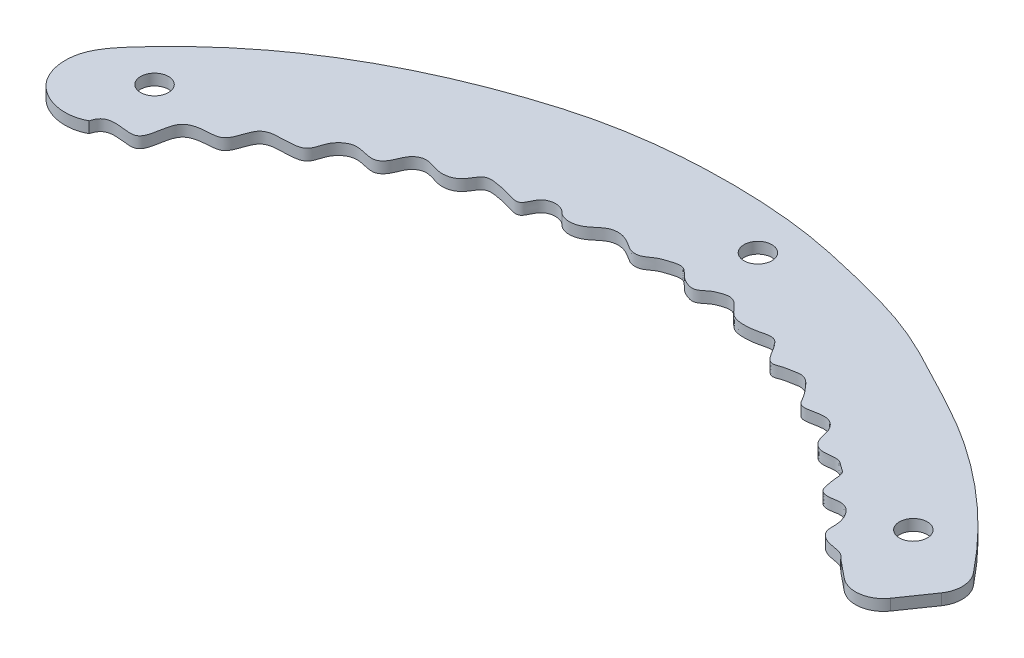
ISO-10303-21;
HEADER;
FILE_DESCRIPTION(('STEP AP214'),'2;1');
FILE_NAME('part.step','',(''),(''),'','','');
FILE_SCHEMA(('AUTOMOTIVE_DESIGN { 1 0 10303 214 1 1 1 1 }'));
ENDSEC;
DATA;
#1=APPLICATION_CONTEXT('core data for automotive mechanical design processes');
#2=APPLICATION_PROTOCOL_DEFINITION('international standard','automotive_design',2000,#1);
#3=PRODUCT_CONTEXT('',#1,'mechanical');
#4=PRODUCT('Part','Part','',(#3));
#5=PRODUCT_RELATED_PRODUCT_CATEGORY('part','',(#4));
#6=PRODUCT_DEFINITION_FORMATION('','',#4);
#7=PRODUCT_DEFINITION_CONTEXT('part definition',#1,'design');
#8=PRODUCT_DEFINITION('design','',#6,#7);
#9=PRODUCT_DEFINITION_SHAPE('','',#8);
#10=(LENGTH_UNIT() NAMED_UNIT(*) SI_UNIT(.MILLI.,.METRE.));
#11=(NAMED_UNIT(*) PLANE_ANGLE_UNIT() SI_UNIT($,.RADIAN.));
#12=(NAMED_UNIT(*) SI_UNIT($,.STERADIAN.) SOLID_ANGLE_UNIT());
#13=UNCERTAINTY_MEASURE_WITH_UNIT(LENGTH_MEASURE(1.E-05),#10,'distance_accuracy_value','');
#14=(GEOMETRIC_REPRESENTATION_CONTEXT(3) GLOBAL_UNCERTAINTY_ASSIGNED_CONTEXT((#13)) GLOBAL_UNIT_ASSIGNED_CONTEXT((#10,
#11,#12)) REPRESENTATION_CONTEXT('',''));
#15=CARTESIAN_POINT('',(0.,0.,0.));
#16=DIRECTION('',(0.,0.,1.));
#17=DIRECTION('',(1.,0.,0.));
#18=AXIS2_PLACEMENT_3D('',#15,#16,#17);
#19=CARTESIAN_POINT('',(3.44900829911821,1.2,6.01107136177327));
#20=DIRECTION('',(0.,1.,0.));
#21=DIRECTION('',(0.,0.,1.));
#22=AXIS2_PLACEMENT_3D('',#19,#20,#21);
#23=PLANE('',#22);
#24=CARTESIAN_POINT('',(0.78303987745354,1.2,0.136157483073447));
#25=DIRECTION('',(0.,1.,0.));
#26=DIRECTION('',(0.,0.,1.));
#27=AXIS2_PLACEMENT_3D('',#24,#25,#26);
#28=CIRCLE('',#27,1.50000000000011);
#29=CARTESIAN_POINT('',(0.78303987745354,1.2,1.63615748307356));
#30=VERTEX_POINT('',#29);
#31=EDGE_CURVE('E248',#30,#30,#28,.T.);
#32=ORIENTED_EDGE('',*,*,#31,.F.);
#33=EDGE_LOOP('',(#32));
#34=FACE_BOUND('',#33,.T.);
#35=CARTESIAN_POINT('',(3.44900829911821,1.2,6.01107136177327));
#36=DIRECTION('',(0.,1.,0.));
#37=DIRECTION('',(0.,0.,1.));
#38=AXIS2_PLACEMENT_3D('',#35,#36,#37);
#39=CIRCLE('',#38,3.00000000000002);
#40=CARTESIAN_POINT('',(1.55484202462136,1.2,8.33747075236784));
#41=VERTEX_POINT('',#40);
#42=CARTESIAN_POINT('',(5.91558487404961,1.2,7.71870129826414));
#43=VERTEX_POINT('',#42);
#44=EDGE_CURVE('E260',#41,#43,#39,.T.);
#45=ORIENTED_EDGE('',*,*,#44,.T.);
#46=DIRECTION('',(0.569209978830285,0.,-0.822192191643794));
#47=VECTOR('',#46,1.);
#48=CARTESIAN_POINT('',(8.14322778461929,1.2,4.50099487188552));
#49=LINE('',#48,#47);
#50=CARTESIAN_POINT('',(8.1432277846193,1.2,4.50099487188553));
#51=VERTEX_POINT('',#50);
#52=EDGE_CURVE('E105',#43,#51,#49,.T.);
#53=ORIENTED_EDGE('',*,*,#52,.T.);
#54=CARTESIAN_POINT('',(5.67665120968791,1.2,2.79336493539468));
#55=DIRECTION('',(0.,1.,0.));
#56=DIRECTION('',(0.,0.,1.));
#57=AXIS2_PLACEMENT_3D('',#54,#55,#56);
#58=CIRCLE('',#57,2.99999999999999);
#59=CARTESIAN_POINT('',(8.02129778197895,1.2,0.921832822113208));
#60=VERTEX_POINT('',#59);
#61=EDGE_CURVE('E262',#51,#60,#58,.T.);
#62=ORIENTED_EDGE('',*,*,#61,.T.);
#63=CARTESIAN_POINT('',(-35.7027580415051,1.2,35.8230309658508));
#64=DIRECTION('',(0.,1.,0.));
#65=DIRECTION('',(0.,0.,1.));
#66=AXIS2_PLACEMENT_3D('',#63,#64,#65);
#67=CIRCLE('',#66,55.9453902437331);
#68=CARTESIAN_POINT('',(-4.57488763843811,1.2,-10.6629064098056));
#69=VERTEX_POINT('',#68);
#70=EDGE_CURVE('E191',#60,#69,#67,.T.);
#71=ORIENTED_EDGE('',*,*,#70,.T.);
#72=CARTESIAN_POINT('',(-4.57488763843811,1.2,-10.6629064098056));
#73=CARTESIAN_POINT('',(-7.04777633310377,1.2,-12.3187998510135));
#74=CARTESIAN_POINT('',(-11.4723769219833,1.2,-14.6181640587533));
#75=CARTESIAN_POINT('',(-18.6446226281622,1.2,-18.4462764903407));
#76=CARTESIAN_POINT('',(-25.5528261175574,1.2,-20.2853460344889));
#77=CARTESIAN_POINT('',(-32.3111472553235,1.2,-21.765124491277));
#78=CARTESIAN_POINT('',(-38.4562227604874,1.2,-22.3344853318809));
#79=CARTESIAN_POINT('',(-46.0367308056514,1.2,-22.3379740281444));
#80=CARTESIAN_POINT('',(-53.5805608519174,1.2,-21.3214272767711));
#81=CARTESIAN_POINT('',(-60.391912278173,1.2,-19.2595532220798));
#82=CARTESIAN_POINT('',(-67.9164928459804,1.2,-16.4005668721405));
#83=CARTESIAN_POINT('',(-77.0440915873863,1.2,-11.4902201250957));
#84=CARTESIAN_POINT('',(-84.229889168822,1.2,-5.09611514235832));
#85=CARTESIAN_POINT('',(-88.4718293066358,1.2,-0.104808879087911));
#86=CARTESIAN_POINT('',(-88.5463339267075,1.2,3.09934105526218));
#87=CARTESIAN_POINT('',(-86.8959532553335,1.2,6.53469906582001));
#88=CARTESIAN_POINT('',(-83.4963465539946,1.2,7.40947439728391));
#89=CARTESIAN_POINT('',(-81.5421780768788,1.2,6.35126814352929));
#90=B_SPLINE_CURVE_WITH_KNOTS('',3,(#72,#73,#74,#75,#76,#77,#78,#79,#80,#81,#82,#83,#84,#85,#86,
#87,#88,#89),.UNSPECIFIED.,.F.,.F.,(4,1,1,1,1,1,1,1,1,1,1,1,1,1,1,4),(0.083499365060497,
0.162308773326712,0.214040794515801,0.297345887842816,0.3491544880349,0.396314502565913,
0.45953043380621,0.548645128958728,0.595484356958903,0.646703324821764,0.760819589852608,
0.864658635925295,0.902713076006373,0.926128155665857,0.944546811556018,1.),.UNSPECIFIED.);
#91=CARTESIAN_POINT('',(-81.5421780768788,1.2,6.35126814352929));
#92=VERTEX_POINT('',#91);
#93=EDGE_CURVE('E183',#69,#92,#90,.T.);
#94=ORIENTED_EDGE('',*,*,#93,.T.);
#95=CARTESIAN_POINT('',(-81.5421780768788,1.2,6.35126814352929));
#96=CARTESIAN_POINT('',(-81.0448448428818,1.2,4.21362532073832));
#97=CARTESIAN_POINT('',(-76.4233455205633,1.2,7.04419919794764));
#98=CARTESIAN_POINT('',(-77.1938888372418,1.2,1.43461180448703));
#99=CARTESIAN_POINT('',(-74.4995580507389,1.2,1.00713796243328));
#100=CARTESIAN_POINT('',(-72.1195795464039,1.2,0.982023335802329));
#101=CARTESIAN_POINT('',(-72.0139132139392,1.2,-2.53193035754506));
#102=CARTESIAN_POINT('',(-69.1934461070888,1.2,-2.2707681802793));
#103=CARTESIAN_POINT('',(-66.9790185832169,1.2,-2.57683442806185));
#104=CARTESIAN_POINT('',(-66.7933372654512,1.2,-4.56149158223045));
#105=CARTESIAN_POINT('',(-65.2281719656522,1.2,-5.86647802015679));
#106=CARTESIAN_POINT('',(-63.704347584588,1.2,-5.43120710896552));
#107=CARTESIAN_POINT('',(-62.4806614615817,1.2,-5.2333978483326));
#108=CARTESIAN_POINT('',(-61.4837151569637,1.2,-6.19912528435516));
#109=CARTESIAN_POINT('',(-61.3005528493581,1.2,-7.50315956175206));
#110=CARTESIAN_POINT('',(-59.783145719068,1.2,-8.3975867452717));
#111=CARTESIAN_POINT('',(-58.5197580633333,1.2,-7.70306229476587));
#112=CARTESIAN_POINT('',(-57.0959702031179,1.2,-7.65884087926026));
#113=CARTESIAN_POINT('',(-55.8360258529427,1.2,-8.29464929645206));
#114=CARTESIAN_POINT('',(-55.3246003603198,1.2,-9.90126935389747));
#115=CARTESIAN_POINT('',(-53.5853261707726,1.2,-9.70208532278235));
#116=CARTESIAN_POINT('',(-52.4002094473756,1.2,-9.42294579581385));
#117=CARTESIAN_POINT('',(-50.5843936123462,1.2,-8.81311630128934));
#118=CARTESIAN_POINT('',(-50.1680473428663,1.2,-11.1138726333681));
#119=CARTESIAN_POINT('',(-48.3351648245672,1.2,-11.1661381134778));
#120=CARTESIAN_POINT('',(-47.7150050803411,1.2,-10.6051101678702));
#121=B_SPLINE_CURVE_WITH_KNOTS('',3,(#95,#96,#97,#98,#99,#100,#101,#102,#103,#104,#105,#106,
#107,#108,#109,#110,#111,#112,#113,#114,#115,#116,#117,#118,#119,#120),.UNSPECIFIED.,.F.,.F.,(4,
1,1,1,1,1,1,1,1,1,1,1,1,1,1,1,1,1,1,1,1,1,1,4),(0.,0.10033187251802,0.186040251980362,
0.234954160897993,0.27030048666237,0.337741821565506,0.401919809800173,0.438279807635281,
0.476829940838354,0.523229195146984,0.559516768423253,0.584172910344551,0.604077360684183,
0.648703102907347,0.670042470876268,0.715950186250387,0.738312733574355,0.768610762270448,
0.808997732952222,0.834826143984133,0.875875240279468,0.90640030465833,0.941714400143514,1.),.UNSPECIFIED.);
#122=CARTESIAN_POINT('',(-47.7150050803411,1.2,-10.6051101678702));
#123=VERTEX_POINT('',#122);
#124=EDGE_CURVE('E175',#92,#123,#121,.T.);
#125=ORIENTED_EDGE('',*,*,#124,.T.);
#126=CARTESIAN_POINT('',(-47.7150050803411,1.2,-10.6051101678702));
#127=CARTESIAN_POINT('',(-47.0690124810321,1.2,-9.90066506813963));
#128=CARTESIAN_POINT('',(-45.1391969493978,1.2,-9.95795741044139));
#129=CARTESIAN_POINT('',(-43.9219754910409,1.2,-11.5863741457182));
#130=CARTESIAN_POINT('',(-42.4007210025674,1.2,-11.7710165682273));
#131=CARTESIAN_POINT('',(-41.3374820071162,1.2,-11.3076810836852));
#132=CARTESIAN_POINT('',(-40.4080819702577,1.2,-10.5713924926002));
#133=CARTESIAN_POINT('',(-39.2432630977495,1.2,-10.6059481905331));
#134=CARTESIAN_POINT('',(-38.4214004000452,1.2,-11.3898176735715));
#135=CARTESIAN_POINT('',(-37.3041253919222,1.2,-11.739033216268));
#136=CARTESIAN_POINT('',(-35.9600154286698,1.2,-12.1776783260087));
#137=CARTESIAN_POINT('',(-35.1697302390645,1.2,-11.0958898837788));
#138=CARTESIAN_POINT('',(-34.3091162567702,1.2,-10.5975749451474));
#139=CARTESIAN_POINT('',(-33.2301982844589,1.2,-10.3267588025516));
#140=CARTESIAN_POINT('',(-32.483614479217,1.2,-11.1724986113062));
#141=CARTESIAN_POINT('',(-31.5559314423124,1.2,-11.5569313141941));
#142=CARTESIAN_POINT('',(-30.496219104149,1.2,-11.8331708357779));
#143=CARTESIAN_POINT('',(-29.5445792105868,1.2,-11.0114210420582));
#144=CARTESIAN_POINT('',(-28.7648620105408,1.2,-9.93104888314241));
#145=CARTESIAN_POINT('',(-27.2750400536467,1.2,-9.79158769570499));
#146=CARTESIAN_POINT('',(-25.6778686598355,1.2,-9.9955076733502));
#147=CARTESIAN_POINT('',(-24.4296320894705,1.2,-10.4937438684952));
#148=CARTESIAN_POINT('',(-23.910622578037,1.2,-9.60570397833224));
#149=B_SPLINE_CURVE_WITH_KNOTS('',3,(#126,#127,#128,#129,#130,#131,#132,#133,#134,#135,#136,
#137,#138,#139,#140,#141,#142,#143,#144,#145,#146,#147,#148),.UNSPECIFIED.,.F.,.F.,(4,1,1,1,1,1,
1,1,1,1,1,1,1,1,1,1,1,1,1,1,4),(0.,0.101433112648439,0.182304189498544,0.213922122931523,
0.268056795835965,0.309965908906496,0.345937919861134,0.389140378033071,0.432998877346524,
0.482664358285046,0.529097115106778,0.566719549823674,0.598853251916691,0.64417277734227,
0.680167064302808,0.715860802220602,0.759457234327231,0.810995739914042,0.863337515382828,
0.916048189125692,1.),.UNSPECIFIED.);
#150=CARTESIAN_POINT('',(-23.910622578037,1.2,-9.60570397833224));
#151=VERTEX_POINT('',#150);
#152=EDGE_CURVE('E130',#123,#151,#149,.T.);
#153=ORIENTED_EDGE('',*,*,#152,.T.);
#154=CARTESIAN_POINT('',(-23.910622578037,1.2,-9.60570397833224));
#155=CARTESIAN_POINT('',(-23.5582513135529,1.2,-9.38304177558806));
#156=CARTESIAN_POINT('',(-22.8500102499487,1.2,-7.30011493564436));
#157=CARTESIAN_POINT('',(-21.4690994371349,1.2,-8.02662073216218));
#158=CARTESIAN_POINT('',(-20.5875764592206,1.2,-8.11523773214938));
#159=CARTESIAN_POINT('',(-19.7095483707754,1.2,-8.39310202218204));
#160=CARTESIAN_POINT('',(-18.8873736075052,1.2,-8.01697173333));
#161=CARTESIAN_POINT('',(-18.2163702789371,1.2,-7.27057210352965));
#162=CARTESIAN_POINT('',(-17.5409166683346,1.2,-6.49538420712898));
#163=CARTESIAN_POINT('',(-16.9173311110878,1.2,-5.16981924116291));
#164=CARTESIAN_POINT('',(-15.3663101547252,1.2,-5.58870520220975));
#165=CARTESIAN_POINT('',(-13.9067451345584,1.2,-5.74785230448149));
#166=CARTESIAN_POINT('',(-12.700950999441,1.2,-4.35010199287027));
#167=CARTESIAN_POINT('',(-12.8698073188407,1.2,-3.10943631230547));
#168=CARTESIAN_POINT('',(-12.1670130888093,1.2,-2.58249548575534));
#169=B_SPLINE_CURVE_WITH_KNOTS('',3,(#154,#155,#156,#157,#158,#159,#160,#161,#162,#163,#164,
#165,#166,#167,#168),.UNSPECIFIED.,.F.,.F.,(4,1,1,1,1,1,1,1,1,1,1,1,4),(0.,0.161236224841132,
0.21234834378781,0.265446348457359,0.336192935648755,0.378687986034091,0.4306367840808,
0.526782427636082,0.583170289821279,0.682556586618731,0.781270877614231,0.853713789343026,1.),.UNSPECIFIED.);
#170=CARTESIAN_POINT('',(-12.1670130888093,1.2,-2.58249548575534));
#171=VERTEX_POINT('',#170);
#172=EDGE_CURVE('E124',#151,#171,#169,.T.);
#173=ORIENTED_EDGE('',*,*,#172,.T.);
#174=CARTESIAN_POINT('',(-12.1670130888093,1.2,-2.58249548575534));
#175=CARTESIAN_POINT('',(-11.4471191644706,1.2,-1.92134095269998));
#176=CARTESIAN_POINT('',(-10.0229848414878,1.2,-2.80818773415737));
#177=CARTESIAN_POINT('',(-8.9763546571775,1.2,-1.80910880069845));
#178=CARTESIAN_POINT('',(-8.21349909352739,1.2,-1.4039744706188));
#179=CARTESIAN_POINT('',(-8.2003912361652,1.2,-0.349911537247775));
#180=CARTESIAN_POINT('',(-8.04255591781491,1.2,0.49397857915872));
#181=CARTESIAN_POINT('',(-7.81895994369961,1.2,1.42941329555678));
#182=CARTESIAN_POINT('',(-6.81689072199512,1.2,1.75353348258345));
#183=CARTESIAN_POINT('',(-5.86360128751454,1.2,1.34252738010585));
#184=CARTESIAN_POINT('',(-4.74128182851249,1.2,1.71096285828227));
#185=CARTESIAN_POINT('',(-4.08275958970314,1.2,2.62138877906185));
#186=CARTESIAN_POINT('',(-3.79245167016543,1.2,3.75124872269137));
#187=CARTESIAN_POINT('',(-3.91045160965189,1.2,4.86930890456373));
#188=CARTESIAN_POINT('',(-3.23211233625173,1.2,5.62677614963317));
#189=CARTESIAN_POINT('',(-2.20666131595101,1.2,6.03043208241771));
#190=CARTESIAN_POINT('',(-1.04611431687965,1.2,6.06255734799648));
#191=CARTESIAN_POINT('',(-0.554897819244199,1.2,6.5645372027341));
#192=CARTESIAN_POINT('',(-0.430182488183412,1.2,6.72125364820013));
#193=B_SPLINE_CURVE_WITH_KNOTS('',3,(#174,#175,#176,#177,#178,#179,#180,#181,#182,#183,#184,
#185,#186,#187,#188,#189,#190,#191,#192),.UNSPECIFIED.,.F.,.F.,(4,1,1,1,1,1,1,1,1,1,1,1,1,1,1,1,
4),(0.,0.0360977535232211,0.0479926916056579,0.0581817737763515,0.0697347680121679,
0.0877085924399377,0.0966984007408338,0.107023851289053,0.126400839421723,0.138602891285937,
0.153227265236612,0.171393147328841,0.187122158128167,0.197485969105478,0.21117177381614,
0.233173167270583,0.241577569364449),.UNSPECIFIED.);
#194=CARTESIAN_POINT('',(-0.430182488183384,1.2,6.72125364820013));
#195=VERTEX_POINT('',#194);
#196=EDGE_CURVE('E128',#171,#195,#193,.T.);
#197=ORIENTED_EDGE('',*,*,#196,.T.);
#198=DIRECTION('',(0.77546646353152,0.,0.631388758165615));
#199=VECTOR('',#198,1.);
#200=CARTESIAN_POINT('',(1.55484202462136,1.2,8.33747075236784));
#201=LINE('',#200,#199);
#202=EDGE_CURVE('E56',#195,#41,#201,.T.);
#203=ORIENTED_EDGE('',*,*,#202,.T.);
#204=EDGE_LOOP('',(#45,#53,#62,#71,#94,#125,#153,#173,#197,#203));
#205=FACE_BOUND('',#204,.T.);
#206=CARTESIAN_POINT('',(-81.4136972901319,1.2,-0.541251493306819));
#207=DIRECTION('',(0.,1.,0.));
#208=DIRECTION('',(0.,0.,1.));
#209=AXIS2_PLACEMENT_3D('',#206,#207,#208);
#210=CIRCLE('',#209,1.5);
#211=CARTESIAN_POINT('',(-81.4136972901319,1.2,0.958748506693179));
#212=VERTEX_POINT('',#211);
#213=EDGE_CURVE('E254',#212,#212,#210,.T.);
#214=ORIENTED_EDGE('',*,*,#213,.F.);
#215=EDGE_LOOP('',(#214));
#216=FACE_BOUND('',#215,.T.);
#217=CARTESIAN_POINT('',(-33.3547852261345,1.2,-17.3022086811354));
#218=DIRECTION('',(0.,1.,0.));
#219=DIRECTION('',(0.,0.,1.));
#220=AXIS2_PLACEMENT_3D('',#217,#218,#219);
#221=CIRCLE('',#220,1.50000000000011);
#222=CARTESIAN_POINT('',(-33.3547852261345,1.2,-15.8022086811352));
#223=VERTEX_POINT('',#222);
#224=EDGE_CURVE('E239',#223,#223,#221,.T.);
#225=ORIENTED_EDGE('',*,*,#224,.F.);
#226=EDGE_LOOP('',(#225));
#227=FACE_BOUND('',#226,.T.);
#228=ADVANCED_FACE('F39',(#34,#205,#216,#227),#23,.T.);
#229=CARTESIAN_POINT('',(3.44900829911821,0.,6.01107136177327));
#230=DIRECTION('',(0.,1.,0.));
#231=DIRECTION('',(0.,0.,1.));
#232=AXIS2_PLACEMENT_3D('',#229,#230,#231);
#233=PLANE('',#232);
#234=CARTESIAN_POINT('',(0.78303987745354,0.,0.136157483073447));
#235=DIRECTION('',(0.,1.,0.));
#236=DIRECTION('',(0.,0.,1.));
#237=AXIS2_PLACEMENT_3D('',#234,#235,#236);
#238=CIRCLE('',#237,1.50000000000011);
#239=CARTESIAN_POINT('',(0.78303987745354,0.,1.63615748307356));
#240=VERTEX_POINT('',#239);
#241=EDGE_CURVE('E245',#240,#240,#238,.T.);
#242=ORIENTED_EDGE('',*,*,#241,.T.);
#243=EDGE_LOOP('',(#242));
#244=FACE_BOUND('',#243,.T.);
#245=CARTESIAN_POINT('',(3.44900829911821,0.,6.01107136177327));
#246=DIRECTION('',(0.,1.,0.));
#247=DIRECTION('',(0.,0.,1.));
#248=AXIS2_PLACEMENT_3D('',#245,#246,#247);
#249=CIRCLE('',#248,3.00000000000002);
#250=CARTESIAN_POINT('',(1.55484202462136,0.,8.33747075236784));
#251=VERTEX_POINT('',#250);
#252=CARTESIAN_POINT('',(5.91558487404961,0.,7.71870129826414));
#253=VERTEX_POINT('',#252);
#254=EDGE_CURVE('E257',#251,#253,#249,.T.);
#255=ORIENTED_EDGE('',*,*,#254,.F.);
#256=DIRECTION('',(0.77546646353152,0.,0.631388758165615));
#257=VECTOR('',#256,1.);
#258=CARTESIAN_POINT('',(1.55484202462136,0.,8.33747075236784));
#259=LINE('',#258,#257);
#260=CARTESIAN_POINT('',(-0.430182488183384,0.,6.72125364820013));
#261=VERTEX_POINT('',#260);
#262=EDGE_CURVE('E97',#261,#251,#259,.T.);
#263=ORIENTED_EDGE('',*,*,#262,.F.);
#264=CARTESIAN_POINT('',(-12.1670130888093,0.,-2.58249548575534));
#265=CARTESIAN_POINT('',(-11.4471191644706,0.,-1.92134095269998));
#266=CARTESIAN_POINT('',(-10.0229848414878,0.,-2.80818773415737));
#267=CARTESIAN_POINT('',(-8.9763546571775,0.,-1.80910880069845));
#268=CARTESIAN_POINT('',(-8.21349909352739,0.,-1.4039744706188));
#269=CARTESIAN_POINT('',(-8.2003912361652,0.,-0.349911537247775));
#270=CARTESIAN_POINT('',(-8.04255591781491,0.,0.49397857915872));
#271=CARTESIAN_POINT('',(-7.81895994369961,0.,1.42941329555678));
#272=CARTESIAN_POINT('',(-6.81689072199512,0.,1.75353348258345));
#273=CARTESIAN_POINT('',(-5.86360128751454,0.,1.34252738010585));
#274=CARTESIAN_POINT('',(-4.74128182851249,0.,1.71096285828227));
#275=CARTESIAN_POINT('',(-4.08275958970314,0.,2.62138877906185));
#276=CARTESIAN_POINT('',(-3.79245167016543,0.,3.75124872269137));
#277=CARTESIAN_POINT('',(-3.91045160965189,0.,4.86930890456373));
#278=CARTESIAN_POINT('',(-3.23211233625173,0.,5.62677614963317));
#279=CARTESIAN_POINT('',(-2.20666131595101,0.,6.03043208241771));
#280=CARTESIAN_POINT('',(-1.04611431687965,0.,6.06255734799648));
#281=CARTESIAN_POINT('',(-0.554897819244199,0.,6.5645372027341));
#282=CARTESIAN_POINT('',(-0.430182488183412,0.,6.72125364820013));
#283=B_SPLINE_CURVE_WITH_KNOTS('',3,(#264,#265,#266,#267,#268,#269,#270,#271,#272,#273,#274,
#275,#276,#277,#278,#279,#280,#281,#282),.UNSPECIFIED.,.F.,.F.,(4,1,1,1,1,1,1,1,1,1,1,1,1,1,1,1,
4),(0.,0.0360977535232211,0.0479926916056579,0.0581817737763515,0.0697347680121679,
0.0877085924399377,0.0966984007408338,0.107023851289053,0.126400839421723,0.138602891285937,
0.153227265236612,0.171393147328841,0.187122158128167,0.197485969105478,0.21117177381614,
0.233173167270583,0.241577569364449),.UNSPECIFIED.);
#284=CARTESIAN_POINT('',(-12.1670130888093,0.,-2.58249548575534));
#285=VERTEX_POINT('',#284);
#286=EDGE_CURVE('E91',#285,#261,#283,.T.);
#287=ORIENTED_EDGE('',*,*,#286,.F.);
#288=CARTESIAN_POINT('',(-23.910622578037,0.,-9.60570397833224));
#289=CARTESIAN_POINT('',(-23.5582513135529,0.,-9.38304177558806));
#290=CARTESIAN_POINT('',(-22.8500102499487,0.,-7.30011493564436));
#291=CARTESIAN_POINT('',(-21.4690994371349,0.,-8.02662073216218));
#292=CARTESIAN_POINT('',(-20.5875764592206,0.,-8.11523773214938));
#293=CARTESIAN_POINT('',(-19.7095483707754,0.,-8.39310202218204));
#294=CARTESIAN_POINT('',(-18.8873736075052,0.,-8.01697173333));
#295=CARTESIAN_POINT('',(-18.2163702789371,0.,-7.27057210352965));
#296=CARTESIAN_POINT('',(-17.5409166683346,0.,-6.49538420712898));
#297=CARTESIAN_POINT('',(-16.9173311110878,0.,-5.16981924116291));
#298=CARTESIAN_POINT('',(-15.3663101547252,0.,-5.58870520220975));
#299=CARTESIAN_POINT('',(-13.9067451345584,0.,-5.74785230448149));
#300=CARTESIAN_POINT('',(-12.700950999441,0.,-4.35010199287027));
#301=CARTESIAN_POINT('',(-12.8698073188407,0.,-3.10943631230547));
#302=CARTESIAN_POINT('',(-12.1670130888093,0.,-2.58249548575534));
#303=B_SPLINE_CURVE_WITH_KNOTS('',3,(#288,#289,#290,#291,#292,#293,#294,#295,#296,#297,#298,
#299,#300,#301,#302),.UNSPECIFIED.,.F.,.F.,(4,1,1,1,1,1,1,1,1,1,1,1,4),(0.,0.161236224841132,
0.21234834378781,0.265446348457359,0.336192935648755,0.378687986034091,0.4306367840808,
0.526782427636082,0.583170289821279,0.682556586618731,0.781270877614231,0.853713789343026,1.),.UNSPECIFIED.);
#304=CARTESIAN_POINT('',(-23.910622578037,0.,-9.60570397833224));
#305=VERTEX_POINT('',#304);
#306=EDGE_CURVE('E138',#305,#285,#303,.T.);
#307=ORIENTED_EDGE('',*,*,#306,.F.);
#308=CARTESIAN_POINT('',(-47.7150050803411,0.,-10.6051101678702));
#309=CARTESIAN_POINT('',(-47.0690124810321,0.,-9.90066506813963));
#310=CARTESIAN_POINT('',(-45.1391969493978,0.,-9.95795741044139));
#311=CARTESIAN_POINT('',(-43.9219754910409,0.,-11.5863741457182));
#312=CARTESIAN_POINT('',(-42.4007210025674,0.,-11.7710165682273));
#313=CARTESIAN_POINT('',(-41.3374820071162,0.,-11.3076810836852));
#314=CARTESIAN_POINT('',(-40.4080819702577,0.,-10.5713924926002));
#315=CARTESIAN_POINT('',(-39.2432630977495,0.,-10.6059481905331));
#316=CARTESIAN_POINT('',(-38.4214004000452,0.,-11.3898176735715));
#317=CARTESIAN_POINT('',(-37.3041253919222,0.,-11.739033216268));
#318=CARTESIAN_POINT('',(-35.9600154286698,0.,-12.1776783260087));
#319=CARTESIAN_POINT('',(-35.1697302390645,0.,-11.0958898837788));
#320=CARTESIAN_POINT('',(-34.3091162567702,0.,-10.5975749451474));
#321=CARTESIAN_POINT('',(-33.2301982844589,0.,-10.3267588025516));
#322=CARTESIAN_POINT('',(-32.483614479217,0.,-11.1724986113062));
#323=CARTESIAN_POINT('',(-31.5559314423124,0.,-11.5569313141941));
#324=CARTESIAN_POINT('',(-30.496219104149,0.,-11.8331708357779));
#325=CARTESIAN_POINT('',(-29.5445792105868,0.,-11.0114210420582));
#326=CARTESIAN_POINT('',(-28.7648620105408,0.,-9.93104888314241));
#327=CARTESIAN_POINT('',(-27.2750400536467,0.,-9.79158769570499));
#328=CARTESIAN_POINT('',(-25.6778686598355,0.,-9.9955076733502));
#329=CARTESIAN_POINT('',(-24.4296320894705,0.,-10.4937438684952));
#330=CARTESIAN_POINT('',(-23.910622578037,0.,-9.60570397833224));
#331=B_SPLINE_CURVE_WITH_KNOTS('',3,(#308,#309,#310,#311,#312,#313,#314,#315,#316,#317,#318,
#319,#320,#321,#322,#323,#324,#325,#326,#327,#328,#329,#330),.UNSPECIFIED.,.F.,.F.,(4,1,1,1,1,1,
1,1,1,1,1,1,1,1,1,1,1,1,1,1,4),(0.,0.101433112648439,0.182304189498544,0.213922122931523,
0.268056795835965,0.309965908906496,0.345937919861134,0.389140378033071,0.432998877346524,
0.482664358285046,0.529097115106778,0.566719549823674,0.598853251916691,0.64417277734227,
0.680167064302808,0.715860802220602,0.759457234327231,0.810995739914042,0.863337515382828,
0.916048189125692,1.),.UNSPECIFIED.);
#332=CARTESIAN_POINT('',(-47.7150050803411,0.,-10.6051101678702));
#333=VERTEX_POINT('',#332);
#334=EDGE_CURVE('E290',#333,#305,#331,.T.);
#335=ORIENTED_EDGE('',*,*,#334,.F.);
#336=CARTESIAN_POINT('',(-81.5421780768788,0.,6.35126814352929));
#337=CARTESIAN_POINT('',(-81.0448448428818,0.,4.21362532073832));
#338=CARTESIAN_POINT('',(-76.4233455205633,0.,7.04419919794764));
#339=CARTESIAN_POINT('',(-77.1938888372418,0.,1.43461180448703));
#340=CARTESIAN_POINT('',(-74.4995580507389,0.,1.00713796243328));
#341=CARTESIAN_POINT('',(-72.1195795464039,0.,0.982023335802329));
#342=CARTESIAN_POINT('',(-72.0139132139392,0.,-2.53193035754506));
#343=CARTESIAN_POINT('',(-69.1934461070888,0.,-2.2707681802793));
#344=CARTESIAN_POINT('',(-66.9790185832169,0.,-2.57683442806185));
#345=CARTESIAN_POINT('',(-66.7933372654512,0.,-4.56149158223045));
#346=CARTESIAN_POINT('',(-65.2281719656522,0.,-5.86647802015679));
#347=CARTESIAN_POINT('',(-63.704347584588,0.,-5.43120710896552));
#348=CARTESIAN_POINT('',(-62.4806614615817,0.,-5.2333978483326));
#349=CARTESIAN_POINT('',(-61.4837151569637,0.,-6.19912528435516));
#350=CARTESIAN_POINT('',(-61.3005528493581,0.,-7.50315956175206));
#351=CARTESIAN_POINT('',(-59.783145719068,0.,-8.3975867452717));
#352=CARTESIAN_POINT('',(-58.5197580633333,0.,-7.70306229476587));
#353=CARTESIAN_POINT('',(-57.0959702031179,0.,-7.65884087926026));
#354=CARTESIAN_POINT('',(-55.8360258529427,0.,-8.29464929645206));
#355=CARTESIAN_POINT('',(-55.3246003603198,0.,-9.90126935389747));
#356=CARTESIAN_POINT('',(-53.5853261707726,0.,-9.70208532278235));
#357=CARTESIAN_POINT('',(-52.4002094473756,0.,-9.42294579581385));
#358=CARTESIAN_POINT('',(-50.5843936123462,0.,-8.81311630128934));
#359=CARTESIAN_POINT('',(-50.1680473428663,0.,-11.1138726333681));
#360=CARTESIAN_POINT('',(-48.3351648245672,0.,-11.1661381134778));
#361=CARTESIAN_POINT('',(-47.7150050803411,0.,-10.6051101678702));
#362=B_SPLINE_CURVE_WITH_KNOTS('',3,(#336,#337,#338,#339,#340,#341,#342,#343,#344,#345,#346,
#347,#348,#349,#350,#351,#352,#353,#354,#355,#356,#357,#358,#359,#360,#361),.UNSPECIFIED.,.F.,
.F.,(4,1,1,1,1,1,1,1,1,1,1,1,1,1,1,1,1,1,1,1,1,1,1,4),(0.,0.10033187251802,0.186040251980362,
0.234954160897993,0.27030048666237,0.337741821565506,0.401919809800173,0.438279807635281,
0.476829940838354,0.523229195146984,0.559516768423253,0.584172910344551,0.604077360684183,
0.648703102907347,0.670042470876268,0.715950186250387,0.738312733574355,0.768610762270448,
0.808997732952222,0.834826143984133,0.875875240279468,0.90640030465833,0.941714400143514,1.),.UNSPECIFIED.);
#363=CARTESIAN_POINT('',(-81.5421780768788,0.,6.35126814352929));
#364=VERTEX_POINT('',#363);
#365=EDGE_CURVE('E287',#364,#333,#362,.T.);
#366=ORIENTED_EDGE('',*,*,#365,.F.);
#367=CARTESIAN_POINT('',(-4.57488763843811,0.,-10.6629064098056));
#368=CARTESIAN_POINT('',(-7.04777633310377,0.,-12.3187998510135));
#369=CARTESIAN_POINT('',(-11.4723769219833,0.,-14.6181640587533));
#370=CARTESIAN_POINT('',(-18.6446226281622,0.,-18.4462764903407));
#371=CARTESIAN_POINT('',(-25.5528261175574,0.,-20.2853460344889));
#372=CARTESIAN_POINT('',(-32.3111472553235,0.,-21.765124491277));
#373=CARTESIAN_POINT('',(-38.4562227604874,0.,-22.3344853318809));
#374=CARTESIAN_POINT('',(-46.0367308056514,0.,-22.3379740281444));
#375=CARTESIAN_POINT('',(-53.5805608519174,0.,-21.3214272767711));
#376=CARTESIAN_POINT('',(-60.391912278173,0.,-19.2595532220798));
#377=CARTESIAN_POINT('',(-67.9164928459804,0.,-16.4005668721405));
#378=CARTESIAN_POINT('',(-77.0440915873863,0.,-11.4902201250957));
#379=CARTESIAN_POINT('',(-84.229889168822,0.,-5.09611514235832));
#380=CARTESIAN_POINT('',(-88.4718293066358,0.,-0.104808879087911));
#381=CARTESIAN_POINT('',(-88.5463339267075,0.,3.09934105526218));
#382=CARTESIAN_POINT('',(-86.8959532553335,0.,6.53469906582001));
#383=CARTESIAN_POINT('',(-83.4963465539946,0.,7.40947439728391));
#384=CARTESIAN_POINT('',(-81.5421780768788,0.,6.35126814352929));
#385=B_SPLINE_CURVE_WITH_KNOTS('',3,(#367,#368,#369,#370,#371,#372,#373,#374,#375,#376,#377,
#378,#379,#380,#381,#382,#383,#384),.UNSPECIFIED.,.F.,.F.,(4,1,1,1,1,1,1,1,1,1,1,1,1,1,1,4),
(0.083499365060497,0.162308773326712,0.214040794515801,0.297345887842816,0.3491544880349,
0.396314502565913,0.45953043380621,0.548645128958728,0.595484356958903,0.646703324821764,
0.760819589852608,0.864658635925295,0.902713076006373,0.926128155665857,0.944546811556018,1.),.UNSPECIFIED.);
#386=CARTESIAN_POINT('',(-4.57488763843811,0.,-10.6629064098056));
#387=VERTEX_POINT('',#386);
#388=EDGE_CURVE('E280',#387,#364,#385,.T.);
#389=ORIENTED_EDGE('',*,*,#388,.F.);
#390=CARTESIAN_POINT('',(-35.7027580415051,0.,35.8230309658508));
#391=DIRECTION('',(0.,1.,0.));
#392=DIRECTION('',(0.,0.,1.));
#393=AXIS2_PLACEMENT_3D('',#390,#391,#392);
#394=CIRCLE('',#393,55.9453902437331);
#395=CARTESIAN_POINT('',(8.02129778197895,0.,0.921832822113208));
#396=VERTEX_POINT('',#395);
#397=EDGE_CURVE('E273',#396,#387,#394,.T.);
#398=ORIENTED_EDGE('',*,*,#397,.F.);
#399=CARTESIAN_POINT('',(5.67665120968791,0.,2.79336493539468));
#400=DIRECTION('',(0.,1.,0.));
#401=DIRECTION('',(0.,0.,1.));
#402=AXIS2_PLACEMENT_3D('',#399,#400,#401);
#403=CIRCLE('',#402,2.99999999999999);
#404=CARTESIAN_POINT('',(8.1432277846193,0.,4.50099487188553));
#405=VERTEX_POINT('',#404);
#406=EDGE_CURVE('E296',#405,#396,#403,.T.);
#407=ORIENTED_EDGE('',*,*,#406,.F.);
#408=DIRECTION('',(0.569209978830285,0.,-0.822192191643794));
#409=VECTOR('',#408,1.);
#410=CARTESIAN_POINT('',(8.14322778461929,0.,4.50099487188552));
#411=LINE('',#410,#409);
#412=EDGE_CURVE('E300',#253,#405,#411,.T.);
#413=ORIENTED_EDGE('',*,*,#412,.F.);
#414=EDGE_LOOP('',(#255,#263,#287,#307,#335,#366,#389,#398,#407,#413));
#415=FACE_BOUND('',#414,.T.);
#416=CARTESIAN_POINT('',(-81.4136972901319,0.,-0.541251493306819));
#417=DIRECTION('',(0.,1.,0.));
#418=DIRECTION('',(0.,0.,1.));
#419=AXIS2_PLACEMENT_3D('',#416,#417,#418);
#420=CIRCLE('',#419,1.5);
#421=CARTESIAN_POINT('',(-81.4136972901319,0.,0.958748506693179));
#422=VERTEX_POINT('',#421);
#423=EDGE_CURVE('E251',#422,#422,#420,.T.);
#424=ORIENTED_EDGE('',*,*,#423,.T.);
#425=EDGE_LOOP('',(#424));
#426=FACE_BOUND('',#425,.T.);
#427=CARTESIAN_POINT('',(-33.3547852261345,0.,-17.3022086811354));
#428=DIRECTION('',(0.,1.,0.));
#429=DIRECTION('',(0.,0.,1.));
#430=AXIS2_PLACEMENT_3D('',#427,#428,#429);
#431=CIRCLE('',#430,1.50000000000011);
#432=CARTESIAN_POINT('',(-33.3547852261345,0.,-15.8022086811352));
#433=VERTEX_POINT('',#432);
#434=EDGE_CURVE('E242',#433,#433,#431,.T.);
#435=ORIENTED_EDGE('',*,*,#434,.T.);
#436=EDGE_LOOP('',(#435));
#437=FACE_BOUND('',#436,.T.);
#438=ADVANCED_FACE('F212',(#244,#415,#426,#437),#233,.F.);
#439=CARTESIAN_POINT('',(3.44900829911821,1.2,6.01107136177327));
#440=DIRECTION('',(0.,-1.,0.));
#441=DIRECTION('',(0.,0.,-1.));
#442=AXIS2_PLACEMENT_3D('',#439,#440,#441);
#443=CYLINDRICAL_SURFACE('',#442,3.00000000000002);
#444=ORIENTED_EDGE('',*,*,#254,.T.);
#445=DIRECTION('',(0.,-1.,0.));
#446=VECTOR('',#445,1.);
#447=CARTESIAN_POINT('',(5.91558487404961,1.2,7.71870129826414));
#448=LINE('',#447,#446);
#449=EDGE_CURVE('E11',#43,#253,#448,.T.);
#450=ORIENTED_EDGE('',*,*,#449,.F.);
#451=ORIENTED_EDGE('',*,*,#44,.F.);
#452=DIRECTION('',(0.,-1.,0.));
#453=VECTOR('',#452,1.);
#454=CARTESIAN_POINT('',(1.55484202462136,1.2,8.33747075236784));
#455=LINE('',#454,#453);
#456=EDGE_CURVE('E144',#41,#251,#455,.T.);
#457=ORIENTED_EDGE('',*,*,#456,.T.);
#458=EDGE_LOOP('',(#444,#450,#451,#457));
#459=FACE_BOUND('',#458,.T.);
#460=ADVANCED_FACE('F41',(#459),#443,.T.);
#461=CARTESIAN_POINT('',(8.14322778461929,1.2,4.50099487188552));
#462=DIRECTION('',(-0.822192191643795,0.,-0.569209978830285));
#463=DIRECTION('',(-0.569209978830285,0.,0.822192191643795));
#464=AXIS2_PLACEMENT_3D('',#461,#462,#463);
#465=PLANE('',#464);
#466=ORIENTED_EDGE('',*,*,#412,.T.);
#467=DIRECTION('',(0.,-1.,0.));
#468=VECTOR('',#467,1.);
#469=CARTESIAN_POINT('',(8.1432277846193,1.2,4.50099487188553));
#470=LINE('',#469,#468);
#471=EDGE_CURVE('E48',#51,#405,#470,.T.);
#472=ORIENTED_EDGE('',*,*,#471,.F.);
#473=ORIENTED_EDGE('',*,*,#52,.F.);
#474=ORIENTED_EDGE('',*,*,#449,.T.);
#475=EDGE_LOOP('',(#466,#472,#473,#474));
#476=FACE_BOUND('',#475,.T.);
#477=ADVANCED_FACE('F206',(#476),#465,.F.);
#478=CARTESIAN_POINT('',(5.67665120968791,1.2,2.79336493539468));
#479=DIRECTION('',(0.,-1.,0.));
#480=DIRECTION('',(0.,0.,-1.));
#481=AXIS2_PLACEMENT_3D('',#478,#479,#480);
#482=CYLINDRICAL_SURFACE('',#481,2.99999999999999);
#483=ORIENTED_EDGE('',*,*,#406,.T.);
#484=DIRECTION('',(0.,-1.,0.));
#485=VECTOR('',#484,1.);
#486=CARTESIAN_POINT('',(8.02129778197895,1.2,0.921832822113208));
#487=LINE('',#486,#485);
#488=EDGE_CURVE('E275',#60,#396,#487,.T.);
#489=ORIENTED_EDGE('',*,*,#488,.F.);
#490=ORIENTED_EDGE('',*,*,#61,.F.);
#491=ORIENTED_EDGE('',*,*,#471,.T.);
#492=EDGE_LOOP('',(#483,#489,#490,#491));
#493=FACE_BOUND('',#492,.T.);
#494=ADVANCED_FACE('F203',(#493),#482,.T.);
#495=CARTESIAN_POINT('',(-35.7027580415051,1.2,35.8230309658508));
#496=DIRECTION('',(0.,-1.,0.));
#497=DIRECTION('',(0.,0.,-1.));
#498=AXIS2_PLACEMENT_3D('',#495,#496,#497);
#499=CYLINDRICAL_SURFACE('',#498,55.9453902437331);
#500=ORIENTED_EDGE('',*,*,#397,.T.);
#501=DIRECTION('',(0.,-1.,0.));
#502=VECTOR('',#501,1.);
#503=CARTESIAN_POINT('',(-4.57488763843811,1.2,-10.6629064098056));
#504=LINE('',#503,#502);
#505=EDGE_CURVE('E271',#69,#387,#504,.T.);
#506=ORIENTED_EDGE('',*,*,#505,.F.);
#507=ORIENTED_EDGE('',*,*,#70,.F.);
#508=ORIENTED_EDGE('',*,*,#488,.T.);
#509=EDGE_LOOP('',(#500,#506,#507,#508));
#510=FACE_BOUND('',#509,.T.);
#511=ADVANCED_FACE('F199',(#510),#499,.T.);
#512=DIRECTION('',(0.,-1.,0.));
#513=VECTOR('',#512,1.);
#514=SURFACE_OF_LINEAR_EXTRUSION('',#90,#513);
#515=ORIENTED_EDGE('',*,*,#388,.T.);
#516=DIRECTION('',(0.,-1.,0.));
#517=VECTOR('',#516,1.);
#518=CARTESIAN_POINT('',(-81.5421780768788,1.2,6.35126814352929));
#519=LINE('',#518,#517);
#520=EDGE_CURVE('E276',#92,#364,#519,.T.);
#521=ORIENTED_EDGE('',*,*,#520,.F.);
#522=ORIENTED_EDGE('',*,*,#93,.F.);
#523=ORIENTED_EDGE('',*,*,#505,.T.);
#524=EDGE_LOOP('',(#515,#521,#522,#523));
#525=FACE_BOUND('',#524,.T.);
#526=ADVANCED_FACE('F196',(#525),#514,.F.);
#527=DIRECTION('',(0.,-1.,0.));
#528=VECTOR('',#527,1.);
#529=SURFACE_OF_LINEAR_EXTRUSION('',#121,#528);
#530=ORIENTED_EDGE('',*,*,#365,.T.);
#531=DIRECTION('',(0.,-1.,0.));
#532=VECTOR('',#531,1.);
#533=CARTESIAN_POINT('',(-47.7150050803411,1.2,-10.6051101678702));
#534=LINE('',#533,#532);
#535=EDGE_CURVE('E283',#123,#333,#534,.T.);
#536=ORIENTED_EDGE('',*,*,#535,.F.);
#537=ORIENTED_EDGE('',*,*,#124,.F.);
#538=ORIENTED_EDGE('',*,*,#520,.T.);
#539=EDGE_LOOP('',(#530,#536,#537,#538));
#540=FACE_BOUND('',#539,.T.);
#541=ADVANCED_FACE('F168',(#540),#529,.F.);
#542=DIRECTION('',(0.,-1.,0.));
#543=VECTOR('',#542,1.);
#544=SURFACE_OF_LINEAR_EXTRUSION('',#149,#543);
#545=ORIENTED_EDGE('',*,*,#334,.T.);
#546=DIRECTION('',(0.,-1.,0.));
#547=VECTOR('',#546,1.);
#548=CARTESIAN_POINT('',(-23.910622578037,1.2,-9.60570397833224));
#549=LINE('',#548,#547);
#550=EDGE_CURVE('E139',#151,#305,#549,.T.);
#551=ORIENTED_EDGE('',*,*,#550,.F.);
#552=ORIENTED_EDGE('',*,*,#152,.F.);
#553=ORIENTED_EDGE('',*,*,#535,.T.);
#554=EDGE_LOOP('',(#545,#551,#552,#553));
#555=FACE_BOUND('',#554,.T.);
#556=ADVANCED_FACE('F165',(#555),#544,.F.);
#557=DIRECTION('',(0.,-1.,0.));
#558=VECTOR('',#557,1.);
#559=SURFACE_OF_LINEAR_EXTRUSION('',#169,#558);
#560=ORIENTED_EDGE('',*,*,#306,.T.);
#561=DIRECTION('',(0.,-1.,0.));
#562=VECTOR('',#561,1.);
#563=CARTESIAN_POINT('',(-12.1670130888093,1.2,-2.58249548575534));
#564=LINE('',#563,#562);
#565=EDGE_CURVE('E135',#171,#285,#564,.T.);
#566=ORIENTED_EDGE('',*,*,#565,.F.);
#567=ORIENTED_EDGE('',*,*,#172,.F.);
#568=ORIENTED_EDGE('',*,*,#550,.T.);
#569=EDGE_LOOP('',(#560,#566,#567,#568));
#570=FACE_BOUND('',#569,.T.);
#571=ADVANCED_FACE('F136',(#570),#559,.F.);
#572=DIRECTION('',(0.,-1.,0.));
#573=VECTOR('',#572,1.);
#574=SURFACE_OF_LINEAR_EXTRUSION('',#193,#573);
#575=ORIENTED_EDGE('',*,*,#286,.T.);
#576=DIRECTION('',(0.,-1.,0.));
#577=VECTOR('',#576,1.);
#578=CARTESIAN_POINT('',(-0.430182488183384,1.2,6.72125364820013));
#579=LINE('',#578,#577);
#580=EDGE_CURVE('E140',#195,#261,#579,.T.);
#581=ORIENTED_EDGE('',*,*,#580,.F.);
#582=ORIENTED_EDGE('',*,*,#196,.F.);
#583=ORIENTED_EDGE('',*,*,#565,.T.);
#584=EDGE_LOOP('',(#575,#581,#582,#583));
#585=FACE_BOUND('',#584,.T.);
#586=ADVANCED_FACE('F142',(#585),#574,.F.);
#587=CARTESIAN_POINT('',(1.55484202462136,1.2,8.33747075236784));
#588=DIRECTION('',(0.631388758165615,0.,-0.77546646353152));
#589=DIRECTION('',(-0.77546646353152,0.,-0.631388758165615));
#590=AXIS2_PLACEMENT_3D('',#587,#588,#589);
#591=PLANE('',#590);
#592=ORIENTED_EDGE('',*,*,#262,.T.);
#593=ORIENTED_EDGE('',*,*,#456,.F.);
#594=ORIENTED_EDGE('',*,*,#202,.F.);
#595=ORIENTED_EDGE('',*,*,#580,.T.);
#596=EDGE_LOOP('',(#592,#593,#594,#595));
#597=FACE_BOUND('',#596,.T.);
#598=ADVANCED_FACE('F161',(#597),#591,.F.);
#599=CARTESIAN_POINT('',(-81.4136972901319,1.2,-0.541251493306819));
#600=DIRECTION('',(0.,-1.,0.));
#601=DIRECTION('',(0.,0.,-1.));
#602=AXIS2_PLACEMENT_3D('',#599,#600,#601);
#603=CYLINDRICAL_SURFACE('',#602,1.5);
#604=ORIENTED_EDGE('',*,*,#213,.T.);
#605=EDGE_LOOP('',(#604));
#606=FACE_BOUND('',#605,.T.);
#607=ORIENTED_EDGE('',*,*,#423,.F.);
#608=EDGE_LOOP('',(#607));
#609=FACE_BOUND('',#608,.T.);
#610=ADVANCED_FACE('F223',(#606,#609),#603,.F.);
#611=CARTESIAN_POINT('',(0.78303987745354,1.2,0.136157483073447));
#612=DIRECTION('',(0.,-1.,0.));
#613=DIRECTION('',(0.,0.,-1.));
#614=AXIS2_PLACEMENT_3D('',#611,#612,#613);
#615=CYLINDRICAL_SURFACE('',#614,1.50000000000011);
#616=ORIENTED_EDGE('',*,*,#31,.T.);
#617=EDGE_LOOP('',(#616));
#618=FACE_BOUND('',#617,.T.);
#619=ORIENTED_EDGE('',*,*,#241,.F.);
#620=EDGE_LOOP('',(#619));
#621=FACE_BOUND('',#620,.T.);
#622=ADVANCED_FACE('F226',(#618,#621),#615,.F.);
#623=CARTESIAN_POINT('',(-33.3547852261345,1.2,-17.3022086811354));
#624=DIRECTION('',(0.,-1.,0.));
#625=DIRECTION('',(0.,0.,-1.));
#626=AXIS2_PLACEMENT_3D('',#623,#624,#625);
#627=CYLINDRICAL_SURFACE('',#626,1.50000000000011);
#628=ORIENTED_EDGE('',*,*,#224,.T.);
#629=EDGE_LOOP('',(#628));
#630=FACE_BOUND('',#629,.T.);
#631=ORIENTED_EDGE('',*,*,#434,.F.);
#632=EDGE_LOOP('',(#631));
#633=FACE_BOUND('',#632,.T.);
#634=ADVANCED_FACE('F230',(#630,#633),#627,.F.);
#635=CLOSED_SHELL('',(#228,#438,#460,#477,#494,#511,#526,#541,#556,#571,#586,#598,#610,#622,#634));
#636=MANIFOLD_SOLID_BREP('B2',#635);
#637=ADVANCED_BREP_SHAPE_REPRESENTATION('',(#18,#636),#14);
#638=SHAPE_DEFINITION_REPRESENTATION(#9,#637);
ENDSEC;
END-ISO-10303-21;
